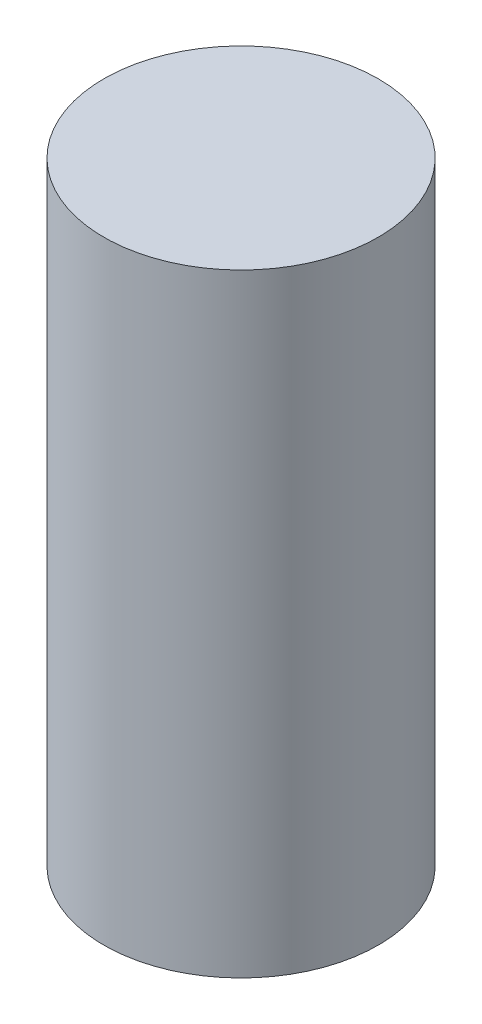
ISO-10303-21;
HEADER;
FILE_DESCRIPTION(('STEP AP214'),'2;1');
FILE_NAME('part.step','',(''),(''),'','','');
FILE_SCHEMA(('AUTOMOTIVE_DESIGN { 1 0 10303 214 1 1 1 1 }'));
ENDSEC;
DATA;
#1=APPLICATION_CONTEXT('core data for automotive mechanical design processes');
#2=APPLICATION_PROTOCOL_DEFINITION('international standard','automotive_design',2000,#1);
#3=PRODUCT_CONTEXT('',#1,'mechanical');
#4=PRODUCT('Part','Part','',(#3));
#5=PRODUCT_RELATED_PRODUCT_CATEGORY('part','',(#4));
#6=PRODUCT_DEFINITION_FORMATION('','',#4);
#7=PRODUCT_DEFINITION_CONTEXT('part definition',#1,'design');
#8=PRODUCT_DEFINITION('design','',#6,#7);
#9=PRODUCT_DEFINITION_SHAPE('','',#8);
#10=(LENGTH_UNIT() NAMED_UNIT(*) SI_UNIT(.MILLI.,.METRE.));
#11=(NAMED_UNIT(*) PLANE_ANGLE_UNIT() SI_UNIT($,.RADIAN.));
#12=(NAMED_UNIT(*) SI_UNIT($,.STERADIAN.) SOLID_ANGLE_UNIT());
#13=UNCERTAINTY_MEASURE_WITH_UNIT(LENGTH_MEASURE(1.E-05),#10,'distance_accuracy_value','');
#14=(GEOMETRIC_REPRESENTATION_CONTEXT(3) GLOBAL_UNCERTAINTY_ASSIGNED_CONTEXT((#13)) GLOBAL_UNIT_ASSIGNED_CONTEXT((#10,
#11,#12)) REPRESENTATION_CONTEXT('',''));
#15=CARTESIAN_POINT('',(0.,0.,0.));
#16=DIRECTION('',(0.,0.,1.));
#17=DIRECTION('',(1.,0.,0.));
#18=AXIS2_PLACEMENT_3D('',#15,#16,#17);
#19=CARTESIAN_POINT('',(0.,8.6,45.445));
#20=DIRECTION('',(0.,-1.,0.));
#21=DIRECTION('',(0.,0.,-1.));
#22=AXIS2_PLACEMENT_3D('',#19,#20,#21);
#23=CYLINDRICAL_SURFACE('',#22,1.925);
#24=CARTESIAN_POINT('',(0.,8.6,45.445));
#25=DIRECTION('',(0.,1.,0.));
#26=DIRECTION('',(0.,0.,1.));
#27=AXIS2_PLACEMENT_3D('',#24,#25,#26);
#28=CIRCLE('',#27,1.925);
#29=CARTESIAN_POINT('',(0.,8.6,43.52));
#30=VERTEX_POINT('',#29);
#31=EDGE_CURVE('E10',#30,#30,#28,.T.);
#32=CARTESIAN_POINT('',(0.,0.,45.445));
#33=DIRECTION('',(0.,1.,0.));
#34=DIRECTION('',(0.,0.,1.));
#35=AXIS2_PLACEMENT_3D('',#32,#33,#34);
#36=CIRCLE('',#35,1.925);
#37=CARTESIAN_POINT('',(0.,0.,43.52));
#38=VERTEX_POINT('',#37);
#39=EDGE_CURVE('E40',#38,#38,#36,.T.);
#40=CARTESIAN_POINT('',(0.,8.6,43.52));
#41=CARTESIAN_POINT('',(0.,8.51041666666667,43.52));
#42=CARTESIAN_POINT('',(0.,8.42083333333333,43.52));
#43=CARTESIAN_POINT('',(0.,8.24166666666667,43.52));
#44=CARTESIAN_POINT('',(0.,8.15208333333333,43.52));
#45=CARTESIAN_POINT('',(0.,7.97291666666666,43.52));
#46=CARTESIAN_POINT('',(0.,7.88333333333333,43.52));
#47=CARTESIAN_POINT('',(0.,7.70416666666667,43.52));
#48=CARTESIAN_POINT('',(0.,7.61458333333333,43.52));
#49=CARTESIAN_POINT('',(0.,7.43541666666667,43.52));
#50=CARTESIAN_POINT('',(0.,7.34583333333333,43.52));
#51=CARTESIAN_POINT('',(0.,7.16666666666667,43.52));
#52=CARTESIAN_POINT('',(0.,7.07708333333333,43.52));
#53=CARTESIAN_POINT('',(0.,6.89791666666667,43.52));
#54=CARTESIAN_POINT('',(0.,6.80833333333333,43.52));
#55=CARTESIAN_POINT('',(0.,6.62916666666667,43.52));
#56=CARTESIAN_POINT('',(0.,6.53958333333333,43.52));
#57=CARTESIAN_POINT('',(0.,6.36041666666667,43.52));
#58=CARTESIAN_POINT('',(0.,6.27083333333333,43.52));
#59=CARTESIAN_POINT('',(0.,6.09166666666667,43.52));
#60=CARTESIAN_POINT('',(0.,6.00208333333333,43.52));
#61=CARTESIAN_POINT('',(0.,5.82291666666666,43.52));
#62=CARTESIAN_POINT('',(0.,5.73333333333333,43.52));
#63=CARTESIAN_POINT('',(0.,5.55416666666666,43.52));
#64=CARTESIAN_POINT('',(0.,5.46458333333333,43.52));
#65=CARTESIAN_POINT('',(0.,5.28541666666666,43.52));
#66=CARTESIAN_POINT('',(0.,5.19583333333333,43.52));
#67=CARTESIAN_POINT('',(0.,5.01666666666666,43.52));
#68=CARTESIAN_POINT('',(0.,4.92708333333333,43.52));
#69=CARTESIAN_POINT('',(0.,4.74791666666667,43.52));
#70=CARTESIAN_POINT('',(0.,4.65833333333333,43.52));
#71=CARTESIAN_POINT('',(0.,4.47916666666667,43.52));
#72=CARTESIAN_POINT('',(0.,4.38958333333333,43.52));
#73=CARTESIAN_POINT('',(0.,4.21041666666667,43.52));
#74=CARTESIAN_POINT('',(0.,4.12083333333333,43.52));
#75=CARTESIAN_POINT('',(0.,3.94166666666667,43.52));
#76=CARTESIAN_POINT('',(0.,3.85208333333333,43.52));
#77=CARTESIAN_POINT('',(0.,3.67291666666666,43.52));
#78=CARTESIAN_POINT('',(0.,3.58333333333333,43.52));
#79=CARTESIAN_POINT('',(0.,3.40416666666666,43.52));
#80=CARTESIAN_POINT('',(0.,3.31458333333333,43.52));
#81=CARTESIAN_POINT('',(0.,3.13541666666666,43.52));
#82=CARTESIAN_POINT('',(0.,3.04583333333333,43.52));
#83=CARTESIAN_POINT('',(0.,2.86666666666666,43.52));
#84=CARTESIAN_POINT('',(0.,2.77708333333333,43.52));
#85=CARTESIAN_POINT('',(0.,2.59791666666666,43.52));
#86=CARTESIAN_POINT('',(0.,2.50833333333333,43.52));
#87=CARTESIAN_POINT('',(0.,2.32916666666666,43.52));
#88=CARTESIAN_POINT('',(0.,2.23958333333333,43.52));
#89=CARTESIAN_POINT('',(0.,2.06041666666666,43.52));
#90=CARTESIAN_POINT('',(0.,1.97083333333333,43.52));
#91=CARTESIAN_POINT('',(0.,1.79166666666666,43.52));
#92=CARTESIAN_POINT('',(0.,1.70208333333333,43.52));
#93=CARTESIAN_POINT('',(0.,1.52291666666666,43.52));
#94=CARTESIAN_POINT('',(0.,1.43333333333333,43.52));
#95=CARTESIAN_POINT('',(0.,1.25416666666666,43.52));
#96=CARTESIAN_POINT('',(0.,1.16458333333333,43.52));
#97=CARTESIAN_POINT('',(0.,0.985416666666664,43.52));
#98=CARTESIAN_POINT('',(0.,0.89583333333333,43.52));
#99=CARTESIAN_POINT('',(0.,0.716666666666664,43.52));
#100=CARTESIAN_POINT('',(0.,0.627083333333331,43.52));
#101=CARTESIAN_POINT('',(0.,0.447916666666665,43.52));
#102=CARTESIAN_POINT('',(0.,0.358333333333331,43.52));
#103=CARTESIAN_POINT('',(0.,0.179166666666665,43.52));
#104=CARTESIAN_POINT('',(0.,0.0895833333333316,43.52));
#105=CARTESIAN_POINT('',(0.,0.,43.52));
#106=B_SPLINE_CURVE_WITH_KNOTS('',3,(#40,#41,#42,#43,#44,#45,#46,#47,#48,#49,#50,#51,#52,#53,
#54,#55,#56,#57,#58,#59,#60,#61,#62,#63,#64,#65,#66,#67,#68,#69,#70,#71,#72,#73,#74,#75,#76,#77,
#78,#79,#80,#81,#82,#83,#84,#85,#86,#87,#88,#89,#90,#91,#92,#93,#94,#95,#96,#97,#98,#99,#100,
#101,#102,#103,#104,#105),.UNSPECIFIED.,.F.,.F.,(4,2,2,2,2,2,2,2,2,2,2,2,2,2,2,2,2,2,2,2,2,2,2,
2,2,2,2,2,2,2,2,2,4),(0.,0.268750000000002,0.537500000000002,0.806250000000001,1.075,1.34375,
1.6125,1.88125,2.15,2.41875,2.6875,2.95625,3.225,3.49375,3.7625,4.03125,4.3,4.56875,4.8375,
5.10625,5.375,5.64375,5.9125,6.18125,6.45,6.71875,6.9875,7.25625,7.525,7.79375,8.0625,8.33125,
8.6),.UNSPECIFIED.);
#107=EDGE_CURVE('BSEAM37',#30,#38,#106,.T.);
#108=ORIENTED_EDGE('',*,*,#31,.F.);
#109=ORIENTED_EDGE('',*,*,#39,.T.);
#110=ORIENTED_EDGE('',*,*,#107,.T.);
#111=ORIENTED_EDGE('',*,*,#107,.F.);
#112=EDGE_LOOP('',(#108,#110,#109,#111));
#113=FACE_BOUND('',#112,.T.);
#114=ADVANCED_FACE('F37',(#113),#23,.T.);
#115=CARTESIAN_POINT('',(0.,8.6,45.445));
#116=DIRECTION('',(0.,1.,0.));
#117=DIRECTION('',(0.,0.,1.));
#118=AXIS2_PLACEMENT_3D('',#115,#116,#117);
#119=PLANE('',#118);
#120=ORIENTED_EDGE('',*,*,#31,.T.);
#121=EDGE_LOOP('',(#120));
#122=FACE_BOUND('',#121,.T.);
#123=ADVANCED_FACE('F52',(#122),#119,.T.);
#124=CARTESIAN_POINT('',(0.,0.,45.445));
#125=DIRECTION('',(0.,1.,0.));
#126=DIRECTION('',(0.,0.,1.));
#127=AXIS2_PLACEMENT_3D('',#124,#125,#126);
#128=PLANE('',#127);
#129=ORIENTED_EDGE('',*,*,#39,.F.);
#130=EDGE_LOOP('',(#129));
#131=FACE_BOUND('',#130,.T.);
#132=ADVANCED_FACE('F50',(#131),#128,.F.);
#133=CLOSED_SHELL('',(#114,#123,#132));
#134=MANIFOLD_SOLID_BREP('B2',#133);
#135=ADVANCED_BREP_SHAPE_REPRESENTATION('',(#18,#134),#14);
#136=SHAPE_DEFINITION_REPRESENTATION(#9,#135);
ENDSEC;
END-ISO-10303-21;
